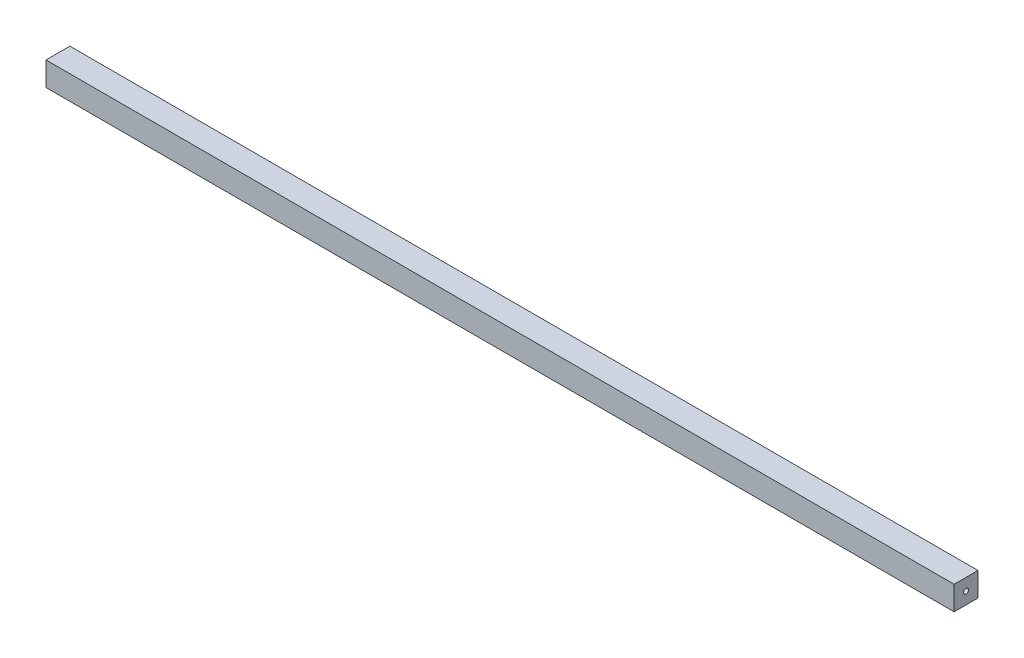
ISO-10303-21;
HEADER;
FILE_DESCRIPTION(('STEP AP214'),'2;1');
FILE_NAME('part.step','',(''),(''),'','','');
FILE_SCHEMA(('AUTOMOTIVE_DESIGN { 1 0 10303 214 1 1 1 1 }'));
ENDSEC;
DATA;
#1=APPLICATION_CONTEXT('core data for automotive mechanical design processes');
#2=APPLICATION_PROTOCOL_DEFINITION('international standard','automotive_design',2000,#1);
#3=PRODUCT_CONTEXT('',#1,'mechanical');
#4=PRODUCT('Part','Part','',(#3));
#5=PRODUCT_RELATED_PRODUCT_CATEGORY('part','',(#4));
#6=PRODUCT_DEFINITION_FORMATION('','',#4);
#7=PRODUCT_DEFINITION_CONTEXT('part definition',#1,'design');
#8=PRODUCT_DEFINITION('design','',#6,#7);
#9=PRODUCT_DEFINITION_SHAPE('','',#8);
#10=(LENGTH_UNIT() NAMED_UNIT(*) SI_UNIT(.MILLI.,.METRE.));
#11=(NAMED_UNIT(*) PLANE_ANGLE_UNIT() SI_UNIT($,.RADIAN.));
#12=(NAMED_UNIT(*) SI_UNIT($,.STERADIAN.) SOLID_ANGLE_UNIT());
#13=UNCERTAINTY_MEASURE_WITH_UNIT(LENGTH_MEASURE(1.E-05),#10,'distance_accuracy_value','');
#14=(GEOMETRIC_REPRESENTATION_CONTEXT(3) GLOBAL_UNCERTAINTY_ASSIGNED_CONTEXT((#13)) GLOBAL_UNIT_ASSIGNED_CONTEXT((#10,
#11,#12)) REPRESENTATION_CONTEXT('',''));
#15=CARTESIAN_POINT('',(0.,0.,0.));
#16=DIRECTION('',(0.,0.,1.));
#17=DIRECTION('',(1.,0.,0.));
#18=AXIS2_PLACEMENT_3D('',#15,#16,#17);
#19=CARTESIAN_POINT('',(380.,-10.,0.));
#20=DIRECTION('',(1.,0.,0.));
#21=DIRECTION('',(0.,1.,0.));
#22=AXIS2_PLACEMENT_3D('',#19,#20,#21);
#23=PLANE('',#22);
#24=CARTESIAN_POINT('',(380.,0.,10.));
#25=DIRECTION('',(1.,0.,0.));
#26=DIRECTION('',(0.,0.,1.));
#27=AXIS2_PLACEMENT_3D('',#24,#25,#26);
#28=CIRCLE('',#27,2.1);
#29=CARTESIAN_POINT('',(380.,0.,12.1));
#30=VERTEX_POINT('',#29);
#31=EDGE_CURVE('E10',#30,#30,#28,.T.);
#32=ORIENTED_EDGE('',*,*,#31,.F.);
#33=EDGE_LOOP('',(#32));
#34=FACE_BOUND('',#33,.T.);
#35=DIRECTION('',(0.,0.,1.));
#36=VECTOR('',#35,1.);
#37=CARTESIAN_POINT('',(380.,-10.,0.));
#38=LINE('',#37,#36);
#39=CARTESIAN_POINT('',(380.,-10.,0.));
#40=VERTEX_POINT('',#39);
#41=CARTESIAN_POINT('',(380.,-10.,20.));
#42=VERTEX_POINT('',#41);
#43=EDGE_CURVE('E109',#40,#42,#38,.T.);
#44=ORIENTED_EDGE('',*,*,#43,.F.);
#45=DIRECTION('',(0.,1.,0.));
#46=VECTOR('',#45,1.);
#47=CARTESIAN_POINT('',(380.,-10.,0.));
#48=LINE('',#47,#46);
#49=CARTESIAN_POINT('',(380.,10.,0.));
#50=VERTEX_POINT('',#49);
#51=EDGE_CURVE('E63',#40,#50,#48,.T.);
#52=ORIENTED_EDGE('',*,*,#51,.T.);
#53=DIRECTION('',(0.,0.,1.));
#54=VECTOR('',#53,1.);
#55=CARTESIAN_POINT('',(380.,10.,0.));
#56=LINE('',#55,#54);
#57=CARTESIAN_POINT('',(380.,10.,20.));
#58=VERTEX_POINT('',#57);
#59=EDGE_CURVE('E25',#50,#58,#56,.T.);
#60=ORIENTED_EDGE('',*,*,#59,.T.);
#61=DIRECTION('',(0.,1.,0.));
#62=VECTOR('',#61,1.);
#63=CARTESIAN_POINT('',(380.,-10.,20.));
#64=LINE('',#63,#62);
#65=EDGE_CURVE('E53',#42,#58,#64,.T.);
#66=ORIENTED_EDGE('',*,*,#65,.F.);
#67=EDGE_LOOP('',(#44,#52,#60,#66));
#68=FACE_BOUND('',#67,.T.);
#69=ADVANCED_FACE('F16',(#34,#68),#23,.T.);
#70=CARTESIAN_POINT('',(-381.,0.,10.));
#71=DIRECTION('',(1.,0.,0.));
#72=DIRECTION('',(0.,0.,1.));
#73=AXIS2_PLACEMENT_3D('',#70,#71,#72);
#74=CYLINDRICAL_SURFACE('',#73,2.1);
#75=ORIENTED_EDGE('',*,*,#31,.T.);
#76=EDGE_LOOP('',(#75));
#77=FACE_BOUND('',#76,.T.);
#78=CARTESIAN_POINT('',(-380.,0.,10.));
#79=DIRECTION('',(1.,0.,0.));
#80=DIRECTION('',(0.,0.,1.));
#81=AXIS2_PLACEMENT_3D('',#78,#79,#80);
#82=CIRCLE('',#81,2.1);
#83=CARTESIAN_POINT('',(-380.,0.,12.1));
#84=VERTEX_POINT('',#83);
#85=EDGE_CURVE('E105',#84,#84,#82,.T.);
#86=ORIENTED_EDGE('',*,*,#85,.F.);
#87=EDGE_LOOP('',(#86));
#88=FACE_BOUND('',#87,.T.);
#89=ADVANCED_FACE('F138',(#77,#88),#74,.F.);
#90=CARTESIAN_POINT('',(-380.,10.,0.));
#91=DIRECTION('',(0.,1.,0.));
#92=DIRECTION('',(1.,0.,0.));
#93=AXIS2_PLACEMENT_3D('',#90,#91,#92);
#94=PLANE('',#93);
#95=DIRECTION('',(1.,0.,0.));
#96=VECTOR('',#95,1.);
#97=CARTESIAN_POINT('',(-380.,10.,0.));
#98=LINE('',#97,#96);
#99=CARTESIAN_POINT('',(-380.,10.,0.));
#100=VERTEX_POINT('',#99);
#101=EDGE_CURVE('E77',#100,#50,#98,.T.);
#102=ORIENTED_EDGE('',*,*,#101,.F.);
#103=DIRECTION('',(0.,0.,1.));
#104=VECTOR('',#103,1.);
#105=CARTESIAN_POINT('',(-380.,10.,0.));
#106=LINE('',#105,#104);
#107=CARTESIAN_POINT('',(-380.,10.,20.));
#108=VERTEX_POINT('',#107);
#109=EDGE_CURVE('E81',#100,#108,#106,.T.);
#110=ORIENTED_EDGE('',*,*,#109,.T.);
#111=DIRECTION('',(1.,0.,0.));
#112=VECTOR('',#111,1.);
#113=CARTESIAN_POINT('',(-380.,10.,20.));
#114=LINE('',#113,#112);
#115=EDGE_CURVE('E74',#108,#58,#114,.T.);
#116=ORIENTED_EDGE('',*,*,#115,.T.);
#117=ORIENTED_EDGE('',*,*,#59,.F.);
#118=EDGE_LOOP('',(#102,#110,#116,#117));
#119=FACE_BOUND('',#118,.T.);
#120=ADVANCED_FACE('F79',(#119),#94,.T.);
#121=CARTESIAN_POINT('',(-380.,-10.,0.));
#122=DIRECTION('',(0.,0.,1.));
#123=DIRECTION('',(1.,0.,0.));
#124=AXIS2_PLACEMENT_3D('',#121,#122,#123);
#125=PLANE('',#124);
#126=ORIENTED_EDGE('',*,*,#101,.T.);
#127=ORIENTED_EDGE('',*,*,#51,.F.);
#128=DIRECTION('',(1.,0.,0.));
#129=VECTOR('',#128,1.);
#130=CARTESIAN_POINT('',(-380.,-10.,0.));
#131=LINE('',#130,#129);
#132=CARTESIAN_POINT('',(-380.,-10.,0.));
#133=VERTEX_POINT('',#132);
#134=EDGE_CURVE('E88',#133,#40,#131,.T.);
#135=ORIENTED_EDGE('',*,*,#134,.F.);
#136=DIRECTION('',(0.,1.,0.));
#137=VECTOR('',#136,1.);
#138=CARTESIAN_POINT('',(-380.,-10.,0.));
#139=LINE('',#138,#137);
#140=EDGE_CURVE('E86',#133,#100,#139,.T.);
#141=ORIENTED_EDGE('',*,*,#140,.T.);
#142=EDGE_LOOP('',(#126,#127,#135,#141));
#143=FACE_BOUND('',#142,.T.);
#144=ADVANCED_FACE('F87',(#143),#125,.F.);
#145=CARTESIAN_POINT('',(-380.,-10.,20.));
#146=DIRECTION('',(0.,0.,1.));
#147=DIRECTION('',(1.,0.,0.));
#148=AXIS2_PLACEMENT_3D('',#145,#146,#147);
#149=PLANE('',#148);
#150=DIRECTION('',(0.,1.,0.));
#151=VECTOR('',#150,1.);
#152=CARTESIAN_POINT('',(-380.,-10.,20.));
#153=LINE('',#152,#151);
#154=CARTESIAN_POINT('',(-380.,-10.,20.));
#155=VERTEX_POINT('',#154);
#156=EDGE_CURVE('E96',#155,#108,#153,.T.);
#157=ORIENTED_EDGE('',*,*,#156,.F.);
#158=DIRECTION('',(1.,0.,0.));
#159=VECTOR('',#158,1.);
#160=CARTESIAN_POINT('',(-380.,-10.,20.));
#161=LINE('',#160,#159);
#162=EDGE_CURVE('E117',#155,#42,#161,.T.);
#163=ORIENTED_EDGE('',*,*,#162,.T.);
#164=ORIENTED_EDGE('',*,*,#65,.T.);
#165=ORIENTED_EDGE('',*,*,#115,.F.);
#166=EDGE_LOOP('',(#157,#163,#164,#165));
#167=FACE_BOUND('',#166,.T.);
#168=ADVANCED_FACE('F127',(#167),#149,.T.);
#169=CARTESIAN_POINT('',(-380.,-10.,0.));
#170=DIRECTION('',(0.,1.,0.));
#171=DIRECTION('',(1.,0.,0.));
#172=AXIS2_PLACEMENT_3D('',#169,#170,#171);
#173=PLANE('',#172);
#174=ORIENTED_EDGE('',*,*,#43,.T.);
#175=ORIENTED_EDGE('',*,*,#162,.F.);
#176=DIRECTION('',(0.,0.,1.));
#177=VECTOR('',#176,1.);
#178=CARTESIAN_POINT('',(-380.,-10.,0.));
#179=LINE('',#178,#177);
#180=EDGE_CURVE('E93',#133,#155,#179,.T.);
#181=ORIENTED_EDGE('',*,*,#180,.F.);
#182=ORIENTED_EDGE('',*,*,#134,.T.);
#183=EDGE_LOOP('',(#174,#175,#181,#182));
#184=FACE_BOUND('',#183,.T.);
#185=ADVANCED_FACE('F126',(#184),#173,.F.);
#186=CARTESIAN_POINT('',(-380.,-10.,0.));
#187=DIRECTION('',(1.,0.,0.));
#188=DIRECTION('',(0.,1.,0.));
#189=AXIS2_PLACEMENT_3D('',#186,#187,#188);
#190=PLANE('',#189);
#191=ORIENTED_EDGE('',*,*,#85,.T.);
#192=EDGE_LOOP('',(#191));
#193=FACE_BOUND('',#192,.T.);
#194=ORIENTED_EDGE('',*,*,#156,.T.);
#195=ORIENTED_EDGE('',*,*,#109,.F.);
#196=ORIENTED_EDGE('',*,*,#140,.F.);
#197=ORIENTED_EDGE('',*,*,#180,.T.);
#198=EDGE_LOOP('',(#194,#195,#196,#197));
#199=FACE_BOUND('',#198,.T.);
#200=ADVANCED_FACE('F95',(#193,#199),#190,.F.);
#201=CLOSED_SHELL('',(#69,#89,#120,#144,#168,#185,#200));
#202=MANIFOLD_SOLID_BREP('B1',#201);
#203=ADVANCED_BREP_SHAPE_REPRESENTATION('',(#18,#202),#14);
#204=SHAPE_DEFINITION_REPRESENTATION(#9,#203);
ENDSEC;
END-ISO-10303-21;
